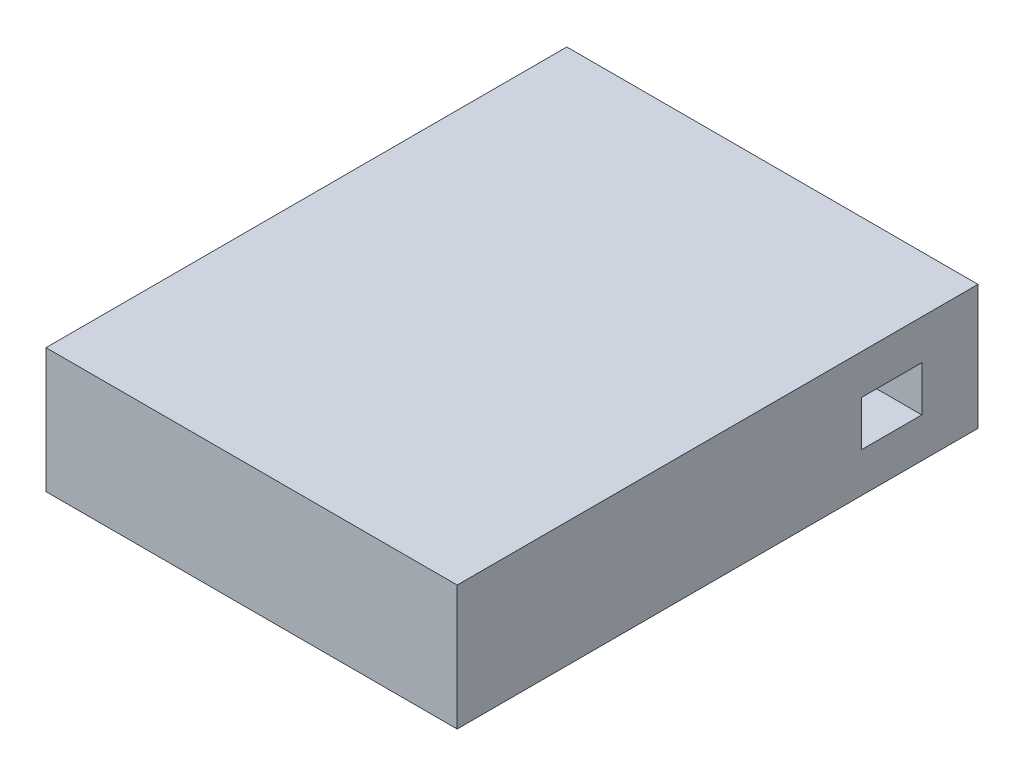
ISO-10303-21;
HEADER;
FILE_DESCRIPTION(('STEP AP214'),'2;1');
FILE_NAME('part.step','',(''),(''),'','','');
FILE_SCHEMA(('AUTOMOTIVE_DESIGN { 1 0 10303 214 1 1 1 1 }'));
ENDSEC;
DATA;
#1=APPLICATION_CONTEXT('core data for automotive mechanical design processes');
#2=APPLICATION_PROTOCOL_DEFINITION('international standard','automotive_design',2000,#1);
#3=PRODUCT_CONTEXT('',#1,'mechanical');
#4=PRODUCT('Part','Part','',(#3));
#5=PRODUCT_RELATED_PRODUCT_CATEGORY('part','',(#4));
#6=PRODUCT_DEFINITION_FORMATION('','',#4);
#7=PRODUCT_DEFINITION_CONTEXT('part definition',#1,'design');
#8=PRODUCT_DEFINITION('design','',#6,#7);
#9=PRODUCT_DEFINITION_SHAPE('','',#8);
#10=(LENGTH_UNIT() NAMED_UNIT(*) SI_UNIT(.MILLI.,.METRE.));
#11=(NAMED_UNIT(*) PLANE_ANGLE_UNIT() SI_UNIT($,.RADIAN.));
#12=(NAMED_UNIT(*) SI_UNIT($,.STERADIAN.) SOLID_ANGLE_UNIT());
#13=UNCERTAINTY_MEASURE_WITH_UNIT(LENGTH_MEASURE(1.E-05),#10,'distance_accuracy_value','');
#14=(GEOMETRIC_REPRESENTATION_CONTEXT(3) GLOBAL_UNCERTAINTY_ASSIGNED_CONTEXT((#13)) GLOBAL_UNIT_ASSIGNED_CONTEXT((#10,
#11,#12)) REPRESENTATION_CONTEXT('',''));
#15=CARTESIAN_POINT('',(0.,0.,0.));
#16=DIRECTION('',(0.,0.,1.));
#17=DIRECTION('',(1.,0.,0.));
#18=AXIS2_PLACEMENT_3D('',#15,#16,#17);
#19=CARTESIAN_POINT('',(15.,9.1,19.));
#20=DIRECTION('',(-1.,0.,0.));
#21=DIRECTION('',(0.,0.,1.));
#22=AXIS2_PLACEMENT_3D('',#19,#20,#21);
#23=PLANE('',#22);
#24=DIRECTION('',(0.,0.,-1.));
#25=VECTOR('',#24,1.);
#26=CARTESIAN_POINT('',(15.,2.9,-14.9));
#27=LINE('',#26,#25);
#28=CARTESIAN_POINT('',(15.,2.9,-10.5));
#29=VERTEX_POINT('',#28);
#30=CARTESIAN_POINT('',(15.,2.9,-14.9));
#31=VERTEX_POINT('',#30);
#32=EDGE_CURVE('E113',#29,#31,#27,.T.);
#33=ORIENTED_EDGE('',*,*,#32,.F.);
#34=DIRECTION('',(0.,-1.,0.));
#35=VECTOR('',#34,1.);
#36=CARTESIAN_POINT('',(15.,6.2,-10.5));
#37=LINE('',#36,#35);
#38=CARTESIAN_POINT('',(15.,6.2,-10.5));
#39=VERTEX_POINT('',#38);
#40=EDGE_CURVE('E51',#39,#29,#37,.T.);
#41=ORIENTED_EDGE('',*,*,#40,.F.);
#42=DIRECTION('',(0.,0.,1.));
#43=VECTOR('',#42,1.);
#44=CARTESIAN_POINT('',(15.,6.2,-14.9));
#45=LINE('',#44,#43);
#46=CARTESIAN_POINT('',(15.,6.2,-14.9));
#47=VERTEX_POINT('',#46);
#48=EDGE_CURVE('E119',#47,#39,#45,.T.);
#49=ORIENTED_EDGE('',*,*,#48,.F.);
#50=DIRECTION('',(0.,1.,0.));
#51=VECTOR('',#50,1.);
#52=CARTESIAN_POINT('',(15.,6.2,-14.9));
#53=LINE('',#52,#51);
#54=EDGE_CURVE('E104',#31,#47,#53,.T.);
#55=ORIENTED_EDGE('',*,*,#54,.F.);
#56=EDGE_LOOP('',(#33,#41,#49,#55));
#57=FACE_BOUND('',#56,.T.);
#58=DIRECTION('',(0.,0.,-1.));
#59=VECTOR('',#58,1.);
#60=CARTESIAN_POINT('',(15.,0.,19.));
#61=LINE('',#60,#59);
#62=CARTESIAN_POINT('',(15.,0.,19.));
#63=VERTEX_POINT('',#62);
#64=CARTESIAN_POINT('',(15.,0.,-19.));
#65=VERTEX_POINT('',#64);
#66=EDGE_CURVE('E126',#63,#65,#61,.T.);
#67=ORIENTED_EDGE('',*,*,#66,.T.);
#68=DIRECTION('',(0.,-1.,0.));
#69=VECTOR('',#68,1.);
#70=CARTESIAN_POINT('',(15.,9.1,-19.));
#71=LINE('',#70,#69);
#72=CARTESIAN_POINT('',(15.,9.1,-19.));
#73=VERTEX_POINT('',#72);
#74=EDGE_CURVE('E155',#73,#65,#71,.T.);
#75=ORIENTED_EDGE('',*,*,#74,.F.);
#76=DIRECTION('',(0.,0.,-1.));
#77=VECTOR('',#76,1.);
#78=CARTESIAN_POINT('',(15.,9.1,19.));
#79=LINE('',#78,#77);
#80=CARTESIAN_POINT('',(15.,9.1,19.));
#81=VERTEX_POINT('',#80);
#82=EDGE_CURVE('E129',#81,#73,#79,.T.);
#83=ORIENTED_EDGE('',*,*,#82,.F.);
#84=DIRECTION('',(0.,-1.,0.));
#85=VECTOR('',#84,1.);
#86=CARTESIAN_POINT('',(15.,9.1,19.));
#87=LINE('',#86,#85);
#88=EDGE_CURVE('E139',#81,#63,#87,.T.);
#89=ORIENTED_EDGE('',*,*,#88,.T.);
#90=EDGE_LOOP('',(#67,#75,#83,#89));
#91=FACE_BOUND('',#90,.T.);
#92=ADVANCED_FACE('F37',(#57,#91),#23,.F.);
#93=CARTESIAN_POINT('',(-15.,9.1,-19.));
#94=DIRECTION('',(0.,0.,1.));
#95=DIRECTION('',(1.,0.,0.));
#96=AXIS2_PLACEMENT_3D('',#93,#94,#95);
#97=PLANE('',#96);
#98=DIRECTION('',(-1.,0.,0.));
#99=VECTOR('',#98,1.);
#100=CARTESIAN_POINT('',(-15.,0.,-19.));
#101=LINE('',#100,#99);
#102=CARTESIAN_POINT('',(-15.,0.,-19.));
#103=VERTEX_POINT('',#102);
#104=EDGE_CURVE('E142',#65,#103,#101,.T.);
#105=ORIENTED_EDGE('',*,*,#104,.T.);
#106=DIRECTION('',(0.,-1.,0.));
#107=VECTOR('',#106,1.);
#108=CARTESIAN_POINT('',(-15.,9.1,-19.));
#109=LINE('',#108,#107);
#110=CARTESIAN_POINT('',(-15.,9.1,-19.));
#111=VERTEX_POINT('',#110);
#112=EDGE_CURVE('E152',#111,#103,#109,.T.);
#113=ORIENTED_EDGE('',*,*,#112,.F.);
#114=DIRECTION('',(-1.,0.,0.));
#115=VECTOR('',#114,1.);
#116=CARTESIAN_POINT('',(-15.,9.1,-19.));
#117=LINE('',#116,#115);
#118=EDGE_CURVE('E132',#73,#111,#117,.T.);
#119=ORIENTED_EDGE('',*,*,#118,.F.);
#120=ORIENTED_EDGE('',*,*,#74,.T.);
#121=EDGE_LOOP('',(#105,#113,#119,#120));
#122=FACE_BOUND('',#121,.T.);
#123=ADVANCED_FACE('F182',(#122),#97,.F.);
#124=CARTESIAN_POINT('',(-15.,9.1,19.));
#125=DIRECTION('',(1.,0.,0.));
#126=DIRECTION('',(0.,0.,-1.));
#127=AXIS2_PLACEMENT_3D('',#124,#125,#126);
#128=PLANE('',#127);
#129=DIRECTION('',(0.,0.,1.));
#130=VECTOR('',#129,1.);
#131=CARTESIAN_POINT('',(-15.,6.19999999999999,19.));
#132=LINE('',#131,#130);
#133=CARTESIAN_POINT('',(-15.,6.2,-14.9));
#134=VERTEX_POINT('',#133);
#135=CARTESIAN_POINT('',(-15.,6.2,-10.5));
#136=VERTEX_POINT('',#135);
#137=EDGE_CURVE('E44',#134,#136,#132,.T.);
#138=ORIENTED_EDGE('',*,*,#137,.T.);
#139=DIRECTION('',(0.,-1.,0.));
#140=VECTOR('',#139,1.);
#141=CARTESIAN_POINT('',(-15.,9.1,-10.5));
#142=LINE('',#141,#140);
#143=CARTESIAN_POINT('',(-15.,2.9,-10.5));
#144=VERTEX_POINT('',#143);
#145=EDGE_CURVE('E11',#136,#144,#142,.T.);
#146=ORIENTED_EDGE('',*,*,#145,.T.);
#147=DIRECTION('',(0.,0.,-1.));
#148=VECTOR('',#147,1.);
#149=CARTESIAN_POINT('',(-15.,2.90000000000001,19.));
#150=LINE('',#149,#148);
#151=CARTESIAN_POINT('',(-15.,2.9,-14.9));
#152=VERTEX_POINT('',#151);
#153=EDGE_CURVE('E158',#144,#152,#150,.T.);
#154=ORIENTED_EDGE('',*,*,#153,.T.);
#155=DIRECTION('',(0.,1.,0.));
#156=VECTOR('',#155,1.);
#157=CARTESIAN_POINT('',(-15.,9.1,-14.9));
#158=LINE('',#157,#156);
#159=EDGE_CURVE('E107',#152,#134,#158,.T.);
#160=ORIENTED_EDGE('',*,*,#159,.T.);
#161=EDGE_LOOP('',(#138,#146,#154,#160));
#162=FACE_BOUND('',#161,.T.);
#163=DIRECTION('',(0.,0.,1.));
#164=VECTOR('',#163,1.);
#165=CARTESIAN_POINT('',(-15.,0.,19.));
#166=LINE('',#165,#164);
#167=CARTESIAN_POINT('',(-15.,0.,19.));
#168=VERTEX_POINT('',#167);
#169=EDGE_CURVE('E144',#103,#168,#166,.T.);
#170=ORIENTED_EDGE('',*,*,#169,.T.);
#171=DIRECTION('',(0.,-1.,0.));
#172=VECTOR('',#171,1.);
#173=CARTESIAN_POINT('',(-15.,9.1,19.));
#174=LINE('',#173,#172);
#175=CARTESIAN_POINT('',(-15.,9.1,19.));
#176=VERTEX_POINT('',#175);
#177=EDGE_CURVE('E149',#176,#168,#174,.T.);
#178=ORIENTED_EDGE('',*,*,#177,.F.);
#179=DIRECTION('',(0.,0.,1.));
#180=VECTOR('',#179,1.);
#181=CARTESIAN_POINT('',(-15.,9.1,19.));
#182=LINE('',#181,#180);
#183=EDGE_CURVE('E135',#111,#176,#182,.T.);
#184=ORIENTED_EDGE('',*,*,#183,.F.);
#185=ORIENTED_EDGE('',*,*,#112,.T.);
#186=EDGE_LOOP('',(#170,#178,#184,#185));
#187=FACE_BOUND('',#186,.T.);
#188=ADVANCED_FACE('F162',(#162,#187),#128,.F.);
#189=CARTESIAN_POINT('',(-15.,9.1,19.));
#190=DIRECTION('',(0.,0.,-1.));
#191=DIRECTION('',(-1.,0.,0.));
#192=AXIS2_PLACEMENT_3D('',#189,#190,#191);
#193=PLANE('',#192);
#194=DIRECTION('',(1.,0.,0.));
#195=VECTOR('',#194,1.);
#196=CARTESIAN_POINT('',(-15.,0.,19.));
#197=LINE('',#196,#195);
#198=EDGE_CURVE('E133',#168,#63,#197,.T.);
#199=ORIENTED_EDGE('',*,*,#198,.T.);
#200=ORIENTED_EDGE('',*,*,#88,.F.);
#201=DIRECTION('',(1.,0.,0.));
#202=VECTOR('',#201,1.);
#203=CARTESIAN_POINT('',(-15.,9.1,19.));
#204=LINE('',#203,#202);
#205=EDGE_CURVE('E137',#176,#81,#204,.T.);
#206=ORIENTED_EDGE('',*,*,#205,.F.);
#207=ORIENTED_EDGE('',*,*,#177,.T.);
#208=EDGE_LOOP('',(#199,#200,#206,#207));
#209=FACE_BOUND('',#208,.T.);
#210=ADVANCED_FACE('F190',(#209),#193,.F.);
#211=CARTESIAN_POINT('',(0.,9.1,0.));
#212=DIRECTION('',(0.,-1.,0.));
#213=DIRECTION('',(0.,0.,-1.));
#214=AXIS2_PLACEMENT_3D('',#211,#212,#213);
#215=PLANE('',#214);
#216=ORIENTED_EDGE('',*,*,#82,.T.);
#217=ORIENTED_EDGE('',*,*,#118,.T.);
#218=ORIENTED_EDGE('',*,*,#183,.T.);
#219=ORIENTED_EDGE('',*,*,#205,.T.);
#220=EDGE_LOOP('',(#216,#217,#218,#219));
#221=FACE_BOUND('',#220,.T.);
#222=ADVANCED_FACE('F176',(#221),#215,.F.);
#223=CARTESIAN_POINT('',(0.,0.,0.));
#224=DIRECTION('',(0.,-1.,0.));
#225=DIRECTION('',(0.,0.,-1.));
#226=AXIS2_PLACEMENT_3D('',#223,#224,#225);
#227=PLANE('',#226);
#228=ORIENTED_EDGE('',*,*,#66,.F.);
#229=ORIENTED_EDGE('',*,*,#198,.F.);
#230=ORIENTED_EDGE('',*,*,#169,.F.);
#231=ORIENTED_EDGE('',*,*,#104,.F.);
#232=EDGE_LOOP('',(#228,#229,#230,#231));
#233=FACE_BOUND('',#232,.T.);
#234=ADVANCED_FACE('F169',(#233),#227,.T.);
#235=CARTESIAN_POINT('',(-31.1,6.2,-10.5));
#236=DIRECTION('',(0.,0.,1.));
#237=DIRECTION('',(1.,0.,0.));
#238=AXIS2_PLACEMENT_3D('',#235,#236,#237);
#239=PLANE('',#238);
#240=DIRECTION('',(1.,0.,0.));
#241=VECTOR('',#240,1.);
#242=CARTESIAN_POINT('',(-31.1,6.2,-10.5));
#243=LINE('',#242,#241);
#244=EDGE_CURVE('E124',#136,#39,#243,.T.);
#245=ORIENTED_EDGE('',*,*,#244,.T.);
#246=ORIENTED_EDGE('',*,*,#40,.T.);
#247=DIRECTION('',(1.,0.,0.));
#248=VECTOR('',#247,1.);
#249=CARTESIAN_POINT('',(-31.1,2.9,-10.5));
#250=LINE('',#249,#248);
#251=EDGE_CURVE('E110',#144,#29,#250,.T.);
#252=ORIENTED_EDGE('',*,*,#251,.F.);
#253=ORIENTED_EDGE('',*,*,#145,.F.);
#254=EDGE_LOOP('',(#245,#246,#252,#253));
#255=FACE_BOUND('',#254,.T.);
#256=ADVANCED_FACE('F167',(#255),#239,.F.);
#257=CARTESIAN_POINT('',(-31.1,6.2,-14.9));
#258=DIRECTION('',(0.,1.,0.));
#259=DIRECTION('',(0.,0.,1.));
#260=AXIS2_PLACEMENT_3D('',#257,#258,#259);
#261=PLANE('',#260);
#262=DIRECTION('',(1.,0.,0.));
#263=VECTOR('',#262,1.);
#264=CARTESIAN_POINT('',(-31.1,6.2,-14.9));
#265=LINE('',#264,#263);
#266=EDGE_CURVE('E109',#134,#47,#265,.T.);
#267=ORIENTED_EDGE('',*,*,#266,.T.);
#268=ORIENTED_EDGE('',*,*,#48,.T.);
#269=ORIENTED_EDGE('',*,*,#244,.F.);
#270=ORIENTED_EDGE('',*,*,#137,.F.);
#271=EDGE_LOOP('',(#267,#268,#269,#270));
#272=FACE_BOUND('',#271,.T.);
#273=ADVANCED_FACE('F166',(#272),#261,.F.);
#274=CARTESIAN_POINT('',(-31.1,6.2,-14.9));
#275=DIRECTION('',(0.,0.,-1.));
#276=DIRECTION('',(-1.,0.,0.));
#277=AXIS2_PLACEMENT_3D('',#274,#275,#276);
#278=PLANE('',#277);
#279=DIRECTION('',(1.,0.,0.));
#280=VECTOR('',#279,1.);
#281=CARTESIAN_POINT('',(-31.1,2.9,-14.9));
#282=LINE('',#281,#280);
#283=EDGE_CURVE('E59',#152,#31,#282,.T.);
#284=ORIENTED_EDGE('',*,*,#283,.T.);
#285=ORIENTED_EDGE('',*,*,#54,.T.);
#286=ORIENTED_EDGE('',*,*,#266,.F.);
#287=ORIENTED_EDGE('',*,*,#159,.F.);
#288=EDGE_LOOP('',(#284,#285,#286,#287));
#289=FACE_BOUND('',#288,.T.);
#290=ADVANCED_FACE('F101',(#289),#278,.F.);
#291=CARTESIAN_POINT('',(-31.1,2.9,-14.9));
#292=DIRECTION('',(0.,-1.,0.));
#293=DIRECTION('',(0.,0.,-1.));
#294=AXIS2_PLACEMENT_3D('',#291,#292,#293);
#295=PLANE('',#294);
#296=ORIENTED_EDGE('',*,*,#251,.T.);
#297=ORIENTED_EDGE('',*,*,#32,.T.);
#298=ORIENTED_EDGE('',*,*,#283,.F.);
#299=ORIENTED_EDGE('',*,*,#153,.F.);
#300=EDGE_LOOP('',(#296,#297,#298,#299));
#301=FACE_BOUND('',#300,.T.);
#302=ADVANCED_FACE('F114',(#301),#295,.F.);
#303=CLOSED_SHELL('',(#92,#123,#188,#210,#222,#234,#256,#273,#290,#302));
#304=MANIFOLD_SOLID_BREP('B2',#303);
#305=ADVANCED_BREP_SHAPE_REPRESENTATION('',(#18,#304),#14);
#306=SHAPE_DEFINITION_REPRESENTATION(#9,#305);
ENDSEC;
END-ISO-10303-21;
